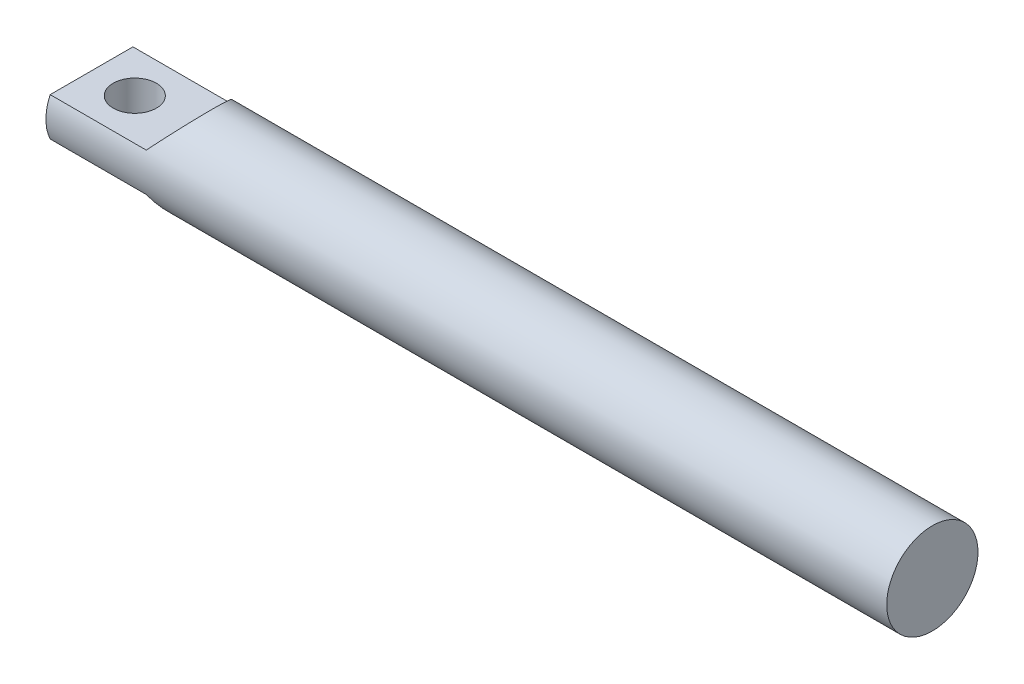
ISO-10303-21;
HEADER;
FILE_DESCRIPTION(('STEP AP214'),'2;1');
FILE_NAME('part.step','',(''),(''),'','','');
FILE_SCHEMA(('AUTOMOTIVE_DESIGN { 1 0 10303 214 1 1 1 1 }'));
ENDSEC;
DATA;
#1=APPLICATION_CONTEXT('core data for automotive mechanical design processes');
#2=APPLICATION_PROTOCOL_DEFINITION('international standard','automotive_design',2000,#1);
#3=PRODUCT_CONTEXT('',#1,'mechanical');
#4=PRODUCT('Part','Part','',(#3));
#5=PRODUCT_RELATED_PRODUCT_CATEGORY('part','',(#4));
#6=PRODUCT_DEFINITION_FORMATION('','',#4);
#7=PRODUCT_DEFINITION_CONTEXT('part definition',#1,'design');
#8=PRODUCT_DEFINITION('design','',#6,#7);
#9=PRODUCT_DEFINITION_SHAPE('','',#8);
#10=(LENGTH_UNIT() NAMED_UNIT(*) SI_UNIT(.MILLI.,.METRE.));
#11=(NAMED_UNIT(*) PLANE_ANGLE_UNIT() SI_UNIT($,.RADIAN.));
#12=(NAMED_UNIT(*) SI_UNIT($,.STERADIAN.) SOLID_ANGLE_UNIT());
#13=UNCERTAINTY_MEASURE_WITH_UNIT(LENGTH_MEASURE(1.E-05),#10,'distance_accuracy_value','');
#14=(GEOMETRIC_REPRESENTATION_CONTEXT(3) GLOBAL_UNCERTAINTY_ASSIGNED_CONTEXT((#13)) GLOBAL_UNIT_ASSIGNED_CONTEXT((#10,
#11,#12)) REPRESENTATION_CONTEXT('',''));
#15=CARTESIAN_POINT('',(0.,0.,0.));
#16=DIRECTION('',(0.,0.,1.));
#17=DIRECTION('',(1.,0.,0.));
#18=AXIS2_PLACEMENT_3D('',#15,#16,#17);
#19=CARTESIAN_POINT('',(175.,0.,0.));
#20=DIRECTION('',(-1.,0.,0.));
#21=DIRECTION('',(0.,0.,1.));
#22=AXIS2_PLACEMENT_3D('',#19,#20,#21);
#23=CYLINDRICAL_SURFACE('',#22,9.5);
#24=CARTESIAN_POINT('',(175.,0.,0.));
#25=DIRECTION('',(1.,0.,0.));
#26=DIRECTION('',(0.,0.,-1.));
#27=AXIS2_PLACEMENT_3D('',#24,#25,#26);
#28=CIRCLE('',#27,9.5);
#29=CARTESIAN_POINT('',(175.,0.,-9.5));
#30=VERTEX_POINT('',#29);
#31=EDGE_CURVE('E85',#30,#30,#28,.T.);
#32=ORIENTED_EDGE('',*,*,#31,.F.);
#33=EDGE_LOOP('',(#32));
#34=FACE_BOUND('',#33,.T.);
#35=CARTESIAN_POINT('',(16.3636363636364,0.,0.));
#36=DIRECTION('',(0.739940073395944,-0.672672793996312,0.));
#37=DIRECTION('',(-0.672672793996312,-0.739940073395944,0.));
#38=AXIS2_PLACEMENT_3D('',#35,#36,#37);
#39=ELLIPSE('',#38,12.8388775545023,9.5);
#40=CARTESIAN_POINT('',(20.,4.,-8.61684396980704));
#41=VERTEX_POINT('',#40);
#42=CARTESIAN_POINT('',(20.,4.,8.61684396980704));
#43=VERTEX_POINT('',#42);
#44=EDGE_CURVE('E11',#41,#43,#39,.T.);
#45=ORIENTED_EDGE('',*,*,#44,.T.);
#46=DIRECTION('',(-1.,0.,0.));
#47=VECTOR('',#46,1.);
#48=CARTESIAN_POINT('',(175.,4.,8.61684396980704));
#49=LINE('',#48,#47);
#50=CARTESIAN_POINT('',(0.,4.,8.61684396980704));
#51=VERTEX_POINT('',#50);
#52=EDGE_CURVE('E94',#43,#51,#49,.T.);
#53=ORIENTED_EDGE('',*,*,#52,.T.);
#54=CARTESIAN_POINT('',(0.,0.,0.));
#55=DIRECTION('',(1.,0.,0.));
#56=DIRECTION('',(0.,0.,-1.));
#57=AXIS2_PLACEMENT_3D('',#54,#55,#56);
#58=CIRCLE('',#57,9.5);
#59=CARTESIAN_POINT('',(0.,-4.,8.61684396980704));
#60=VERTEX_POINT('',#59);
#61=EDGE_CURVE('E93',#51,#60,#58,.T.);
#62=ORIENTED_EDGE('',*,*,#61,.T.);
#63=DIRECTION('',(-1.,0.,0.));
#64=VECTOR('',#63,1.);
#65=CARTESIAN_POINT('',(175.,-4.,8.61684396980704));
#66=LINE('',#65,#64);
#67=CARTESIAN_POINT('',(20.,-4.,8.61684396980703));
#68=VERTEX_POINT('',#67);
#69=EDGE_CURVE('E51',#60,#68,#66,.F.);
#70=ORIENTED_EDGE('',*,*,#69,.T.);
#71=CARTESIAN_POINT('',(16.3636363636363,0.,0.));
#72=DIRECTION('',(0.739940073395944,0.672672793996313,0.));
#73=DIRECTION('',(-0.672672793996313,0.739940073395944,0.));
#74=AXIS2_PLACEMENT_3D('',#71,#72,#73);
#75=ELLIPSE('',#74,12.8388775545023,9.5);
#76=CARTESIAN_POINT('',(20.,-4.,-8.61684396980703));
#77=VERTEX_POINT('',#76);
#78=EDGE_CURVE('E44',#68,#77,#75,.T.);
#79=ORIENTED_EDGE('',*,*,#78,.T.);
#80=DIRECTION('',(-1.,0.,0.));
#81=VECTOR('',#80,1.);
#82=CARTESIAN_POINT('',(175.,-4.,-8.61684396980704));
#83=LINE('',#82,#81);
#84=CARTESIAN_POINT('',(0.,-4.,-8.61684396980704));
#85=VERTEX_POINT('',#84);
#86=EDGE_CURVE('E78',#77,#85,#83,.T.);
#87=ORIENTED_EDGE('',*,*,#86,.T.);
#88=CARTESIAN_POINT('',(0.,4.,-8.61684396980704));
#89=VERTEX_POINT('',#88);
#90=EDGE_CURVE('E90',#85,#89,#58,.T.);
#91=ORIENTED_EDGE('',*,*,#90,.T.);
#92=DIRECTION('',(-1.,0.,0.));
#93=VECTOR('',#92,1.);
#94=CARTESIAN_POINT('',(175.,4.,-8.61684396980704));
#95=LINE('',#94,#93);
#96=EDGE_CURVE('E59',#89,#41,#95,.F.);
#97=ORIENTED_EDGE('',*,*,#96,.T.);
#98=EDGE_LOOP('',(#45,#53,#62,#70,#79,#87,#91,#97));
#99=FACE_BOUND('',#98,.T.);
#100=ADVANCED_FACE('F37',(#34,#99),#23,.T.);
#101=CARTESIAN_POINT('',(175.,0.,0.));
#102=DIRECTION('',(1.,0.,0.));
#103=DIRECTION('',(0.,0.,-1.));
#104=AXIS2_PLACEMENT_3D('',#101,#102,#103);
#105=PLANE('',#104);
#106=ORIENTED_EDGE('',*,*,#31,.T.);
#107=EDGE_LOOP('',(#106));
#108=FACE_BOUND('',#107,.T.);
#109=ADVANCED_FACE('F135',(#108),#105,.T.);
#110=CARTESIAN_POINT('',(0.,0.,0.));
#111=DIRECTION('',(1.,0.,0.));
#112=DIRECTION('',(0.,0.,-1.));
#113=AXIS2_PLACEMENT_3D('',#110,#111,#112);
#114=PLANE('',#113);
#115=ORIENTED_EDGE('',*,*,#61,.F.);
#116=DIRECTION('',(0.,0.,-1.));
#117=VECTOR('',#116,1.);
#118=CARTESIAN_POINT('',(0.,4.,0.));
#119=LINE('',#118,#117);
#120=EDGE_CURVE('E84',#51,#89,#119,.T.);
#121=ORIENTED_EDGE('',*,*,#120,.T.);
#122=ORIENTED_EDGE('',*,*,#90,.F.);
#123=DIRECTION('',(0.,0.,1.));
#124=VECTOR('',#123,1.);
#125=CARTESIAN_POINT('',(0.,-4.,0.));
#126=LINE('',#125,#124);
#127=EDGE_CURVE('E75',#85,#60,#126,.T.);
#128=ORIENTED_EDGE('',*,*,#127,.T.);
#129=EDGE_LOOP('',(#115,#121,#122,#128));
#130=FACE_BOUND('',#129,.T.);
#131=ADVANCED_FACE('F92',(#130),#114,.F.);
#132=CARTESIAN_POINT('',(25.,-9.5,-9.5));
#133=DIRECTION('',(0.739940073395944,0.672672793996313,0.));
#134=DIRECTION('',(-0.672672793996313,0.739940073395944,0.));
#135=AXIS2_PLACEMENT_3D('',#132,#133,#134);
#136=PLANE('',#135);
#137=DIRECTION('',(0.,0.,1.));
#138=VECTOR('',#137,1.);
#139=CARTESIAN_POINT('',(20.,-4.,-9.5));
#140=LINE('',#139,#138);
#141=EDGE_CURVE('E105',#77,#68,#140,.T.);
#142=ORIENTED_EDGE('',*,*,#141,.F.);
#143=ORIENTED_EDGE('',*,*,#78,.F.);
#144=EDGE_LOOP('',(#142,#143));
#145=FACE_BOUND('',#144,.T.);
#146=ADVANCED_FACE('F130',(#145),#136,.F.);
#147=CARTESIAN_POINT('',(20.,-4.,-9.5));
#148=DIRECTION('',(0.,1.,0.));
#149=DIRECTION('',(0.,0.,1.));
#150=AXIS2_PLACEMENT_3D('',#147,#148,#149);
#151=PLANE('',#150);
#152=CARTESIAN_POINT('',(9.,-4.,0.));
#153=DIRECTION('',(0.,1.,0.));
#154=DIRECTION('',(0.,0.,1.));
#155=AXIS2_PLACEMENT_3D('',#152,#153,#154);
#156=CIRCLE('',#155,4.5);
#157=CARTESIAN_POINT('',(9.,-4.,4.5));
#158=VERTEX_POINT('',#157);
#159=EDGE_CURVE('E107',#158,#158,#156,.T.);
#160=ORIENTED_EDGE('',*,*,#159,.T.);
#161=EDGE_LOOP('',(#160));
#162=FACE_BOUND('',#161,.T.);
#163=ORIENTED_EDGE('',*,*,#141,.T.);
#164=ORIENTED_EDGE('',*,*,#69,.F.);
#165=ORIENTED_EDGE('',*,*,#127,.F.);
#166=ORIENTED_EDGE('',*,*,#86,.F.);
#167=EDGE_LOOP('',(#163,#164,#165,#166));
#168=FACE_BOUND('',#167,.T.);
#169=ADVANCED_FACE('F77',(#162,#168),#151,.F.);
#170=CARTESIAN_POINT('',(25.,9.5,-9.5));
#171=DIRECTION('',(0.739940073395944,-0.672672793996312,0.));
#172=DIRECTION('',(0.672672793996312,0.739940073395944,0.));
#173=AXIS2_PLACEMENT_3D('',#170,#171,#172);
#174=PLANE('',#173);
#175=DIRECTION('',(0.,0.,1.));
#176=VECTOR('',#175,1.);
#177=CARTESIAN_POINT('',(20.,4.,-9.5));
#178=LINE('',#177,#176);
#179=EDGE_CURVE('E104',#41,#43,#178,.T.);
#180=ORIENTED_EDGE('',*,*,#179,.T.);
#181=ORIENTED_EDGE('',*,*,#44,.F.);
#182=EDGE_LOOP('',(#180,#181));
#183=FACE_BOUND('',#182,.T.);
#184=ADVANCED_FACE('F121',(#183),#174,.F.);
#185=CARTESIAN_POINT('',(20.,4.,-9.5));
#186=DIRECTION('',(0.,-1.,0.));
#187=DIRECTION('',(0.,0.,-1.));
#188=AXIS2_PLACEMENT_3D('',#185,#186,#187);
#189=PLANE('',#188);
#190=CARTESIAN_POINT('',(9.,4.,0.));
#191=DIRECTION('',(0.,1.,0.));
#192=DIRECTION('',(0.,0.,1.));
#193=AXIS2_PLACEMENT_3D('',#190,#191,#192);
#194=CIRCLE('',#193,4.5);
#195=CARTESIAN_POINT('',(9.,4.,4.5));
#196=VERTEX_POINT('',#195);
#197=EDGE_CURVE('E112',#196,#196,#194,.T.);
#198=ORIENTED_EDGE('',*,*,#197,.F.);
#199=EDGE_LOOP('',(#198));
#200=FACE_BOUND('',#199,.T.);
#201=ORIENTED_EDGE('',*,*,#179,.F.);
#202=ORIENTED_EDGE('',*,*,#96,.F.);
#203=ORIENTED_EDGE('',*,*,#120,.F.);
#204=ORIENTED_EDGE('',*,*,#52,.F.);
#205=EDGE_LOOP('',(#201,#202,#203,#204));
#206=FACE_BOUND('',#205,.T.);
#207=ADVANCED_FACE('F119',(#200,#206),#189,.F.);
#208=CARTESIAN_POINT('',(9.,-9.5,0.));
#209=DIRECTION('',(0.,1.,0.));
#210=DIRECTION('',(0.,0.,1.));
#211=AXIS2_PLACEMENT_3D('',#208,#209,#210);
#212=CYLINDRICAL_SURFACE('',#211,4.5);
#213=ORIENTED_EDGE('',*,*,#197,.T.);
#214=EDGE_LOOP('',(#213));
#215=FACE_BOUND('',#214,.T.);
#216=ORIENTED_EDGE('',*,*,#159,.F.);
#217=EDGE_LOOP('',(#216));
#218=FACE_BOUND('',#217,.T.);
#219=ADVANCED_FACE('F116',(#215,#218),#212,.F.);
#220=CLOSED_SHELL('',(#100,#109,#131,#146,#169,#184,#207,#219));
#221=MANIFOLD_SOLID_BREP('B2',#220);
#222=ADVANCED_BREP_SHAPE_REPRESENTATION('',(#18,#221),#14);
#223=SHAPE_DEFINITION_REPRESENTATION(#9,#222);
ENDSEC;
END-ISO-10303-21;
